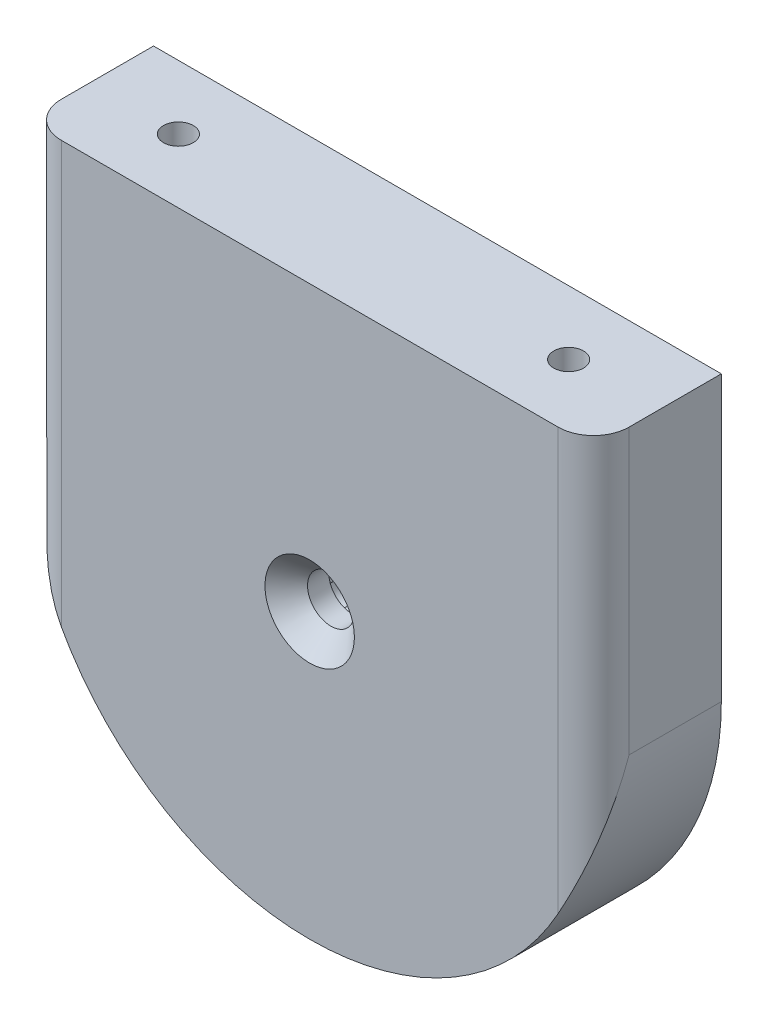
ISO-10303-21;
HEADER;
FILE_DESCRIPTION(('STEP AP214'),'2;1');
FILE_NAME('part.step','',(''),(''),'','','');
FILE_SCHEMA(('AUTOMOTIVE_DESIGN { 1 0 10303 214 1 1 1 1 }'));
ENDSEC;
DATA;
#1=APPLICATION_CONTEXT('core data for automotive mechanical design processes');
#2=APPLICATION_PROTOCOL_DEFINITION('international standard','automotive_design',2000,#1);
#3=PRODUCT_CONTEXT('',#1,'mechanical');
#4=PRODUCT('Part','Part','',(#3));
#5=PRODUCT_RELATED_PRODUCT_CATEGORY('part','',(#4));
#6=PRODUCT_DEFINITION_FORMATION('','',#4);
#7=PRODUCT_DEFINITION_CONTEXT('part definition',#1,'design');
#8=PRODUCT_DEFINITION('design','',#6,#7);
#9=PRODUCT_DEFINITION_SHAPE('','',#8);
#10=(LENGTH_UNIT() NAMED_UNIT(*) SI_UNIT(.MILLI.,.METRE.));
#11=(NAMED_UNIT(*) PLANE_ANGLE_UNIT() SI_UNIT($,.RADIAN.));
#12=(NAMED_UNIT(*) SI_UNIT($,.STERADIAN.) SOLID_ANGLE_UNIT());
#13=UNCERTAINTY_MEASURE_WITH_UNIT(LENGTH_MEASURE(1.E-05),#10,'distance_accuracy_value','');
#14=(GEOMETRIC_REPRESENTATION_CONTEXT(3) GLOBAL_UNCERTAINTY_ASSIGNED_CONTEXT((#13)) GLOBAL_UNIT_ASSIGNED_CONTEXT((#10,
#11,#12)) REPRESENTATION_CONTEXT('',''));
#15=CARTESIAN_POINT('',(0.,0.,0.));
#16=DIRECTION('',(0.,0.,1.));
#17=DIRECTION('',(1.,0.,0.));
#18=AXIS2_PLACEMENT_3D('',#15,#16,#17);
#19=CARTESIAN_POINT('',(0.,0.,0.));
#20=DIRECTION('',(0.,0.,1.));
#21=DIRECTION('',(1.,0.,0.));
#22=AXIS2_PLACEMENT_3D('',#19,#20,#21);
#23=PLANE('',#22);
#24=CARTESIAN_POINT('',(-8.,-8.,0.));
#25=DIRECTION('',(0.,0.,1.));
#26=DIRECTION('',(1.,0.,0.));
#27=AXIS2_PLACEMENT_3D('',#24,#25,#26);
#28=CIRCLE('',#27,2.);
#29=CARTESIAN_POINT('',(-8.,-6.,0.));
#30=VERTEX_POINT('',#29);
#31=CARTESIAN_POINT('',(-6.,-8.,0.));
#32=VERTEX_POINT('',#31);
#33=EDGE_CURVE('E350',#30,#32,#28,.T.);
#34=ORIENTED_EDGE('',*,*,#33,.T.);
#35=DIRECTION('',(1.,0.,0.));
#36=VECTOR('',#35,1.);
#37=CARTESIAN_POINT('',(0.,-8.,0.));
#38=LINE('',#37,#36);
#39=CARTESIAN_POINT('',(6.,-8.,0.));
#40=VERTEX_POINT('',#39);
#41=EDGE_CURVE('E196',#32,#40,#38,.T.);
#42=ORIENTED_EDGE('',*,*,#41,.T.);
#43=CARTESIAN_POINT('',(8.,-8.,0.));
#44=DIRECTION('',(0.,0.,1.));
#45=DIRECTION('',(1.,0.,0.));
#46=AXIS2_PLACEMENT_3D('',#43,#44,#45);
#47=CIRCLE('',#46,2.);
#48=CARTESIAN_POINT('',(8.,-6.,0.));
#49=VERTEX_POINT('',#48);
#50=EDGE_CURVE('E388',#40,#49,#47,.T.);
#51=ORIENTED_EDGE('',*,*,#50,.T.);
#52=DIRECTION('',(0.,1.,0.));
#53=VECTOR('',#52,1.);
#54=CARTESIAN_POINT('',(8.,0.,0.));
#55=LINE('',#54,#53);
#56=CARTESIAN_POINT('',(8.,6.,0.));
#57=VERTEX_POINT('',#56);
#58=EDGE_CURVE('E385',#49,#57,#55,.T.);
#59=ORIENTED_EDGE('',*,*,#58,.T.);
#60=CARTESIAN_POINT('',(8.,8.,0.));
#61=DIRECTION('',(0.,0.,1.));
#62=DIRECTION('',(1.,0.,0.));
#63=AXIS2_PLACEMENT_3D('',#60,#61,#62);
#64=CIRCLE('',#63,2.);
#65=CARTESIAN_POINT('',(6.,8.,0.));
#66=VERTEX_POINT('',#65);
#67=EDGE_CURVE('E382',#57,#66,#64,.T.);
#68=ORIENTED_EDGE('',*,*,#67,.T.);
#69=DIRECTION('',(1.,0.,0.));
#70=VECTOR('',#69,1.);
#71=CARTESIAN_POINT('',(0.,8.,0.));
#72=LINE('',#71,#70);
#73=CARTESIAN_POINT('',(-6.,8.,0.));
#74=VERTEX_POINT('',#73);
#75=EDGE_CURVE('E379',#74,#66,#72,.T.);
#76=ORIENTED_EDGE('',*,*,#75,.F.);
#77=CARTESIAN_POINT('',(-8.,8.,0.));
#78=DIRECTION('',(0.,0.,1.));
#79=DIRECTION('',(1.,0.,0.));
#80=AXIS2_PLACEMENT_3D('',#77,#78,#79);
#81=CIRCLE('',#80,2.);
#82=CARTESIAN_POINT('',(-8.,6.,0.));
#83=VERTEX_POINT('',#82);
#84=EDGE_CURVE('E376',#74,#83,#81,.T.);
#85=ORIENTED_EDGE('',*,*,#84,.T.);
#86=DIRECTION('',(0.,1.,0.));
#87=VECTOR('',#86,1.);
#88=CARTESIAN_POINT('',(-8.,0.,0.));
#89=LINE('',#88,#87);
#90=EDGE_CURVE('E373',#30,#83,#89,.T.);
#91=ORIENTED_EDGE('',*,*,#90,.F.);
#92=EDGE_LOOP('',(#34,#42,#51,#59,#68,#76,#85,#91));
#93=FACE_BOUND('',#92,.T.);
#94=DIRECTION('',(0.,1.,0.));
#95=VECTOR('',#94,1.);
#96=CARTESIAN_POINT('',(40.,0.,0.));
#97=LINE('',#96,#95);
#98=CARTESIAN_POINT('',(40.,0.,0.));
#99=VERTEX_POINT('',#98);
#100=CARTESIAN_POINT('',(40.,40.,0.));
#101=VERTEX_POINT('',#100);
#102=EDGE_CURVE('E185',#99,#101,#97,.T.);
#103=ORIENTED_EDGE('',*,*,#102,.F.);
#104=CARTESIAN_POINT('',(0.,0.,0.));
#105=DIRECTION('',(0.,0.,1.));
#106=DIRECTION('',(1.,0.,0.));
#107=AXIS2_PLACEMENT_3D('',#104,#105,#106);
#108=CIRCLE('',#107,40.);
#109=CARTESIAN_POINT('',(-40.,0.,0.));
#110=VERTEX_POINT('',#109);
#111=EDGE_CURVE('E172',#110,#99,#108,.T.);
#112=ORIENTED_EDGE('',*,*,#111,.F.);
#113=DIRECTION('',(0.,1.,0.));
#114=VECTOR('',#113,1.);
#115=CARTESIAN_POINT('',(-40.,0.,0.));
#116=LINE('',#115,#114);
#117=CARTESIAN_POINT('',(-40.,40.,0.));
#118=VERTEX_POINT('',#117);
#119=EDGE_CURVE('E192',#110,#118,#116,.T.);
#120=ORIENTED_EDGE('',*,*,#119,.T.);
#121=DIRECTION('',(-1.,0.,0.));
#122=VECTOR('',#121,1.);
#123=CARTESIAN_POINT('',(0.,40.,0.));
#124=LINE('',#123,#122);
#125=EDGE_CURVE('E191',#101,#118,#124,.T.);
#126=ORIENTED_EDGE('',*,*,#125,.F.);
#127=EDGE_LOOP('',(#103,#112,#120,#126));
#128=FACE_BOUND('',#127,.T.);
#129=ADVANCED_FACE('F60',(#93,#128),#23,.F.);
#130=CARTESIAN_POINT('',(0.,0.,18.));
#131=DIRECTION('',(0.,0.,1.));
#132=DIRECTION('',(1.,0.,0.));
#133=AXIS2_PLACEMENT_3D('',#130,#131,#132);
#134=PLANE('',#133);
#135=CARTESIAN_POINT('',(0.,0.,18.));
#136=DIRECTION('',(0.,0.,1.));
#137=DIRECTION('',(1.,0.,0.));
#138=AXIS2_PLACEMENT_3D('',#135,#136,#137);
#139=CIRCLE('',#138,6.3);
#140=CARTESIAN_POINT('',(6.3,0.,18.));
#141=VERTEX_POINT('',#140);
#142=EDGE_CURVE('E343',#141,#141,#139,.T.);
#143=ORIENTED_EDGE('',*,*,#142,.F.);
#144=EDGE_LOOP('',(#143));
#145=FACE_BOUND('',#144,.T.);
#146=CARTESIAN_POINT('',(0.,0.,18.));
#147=DIRECTION('',(0.,0.,1.));
#148=DIRECTION('',(1.,0.,0.));
#149=AXIS2_PLACEMENT_3D('',#146,#147,#148);
#150=CIRCLE('',#149,40.);
#151=CARTESIAN_POINT('',(-35.,-19.3649167310371,18.));
#152=VERTEX_POINT('',#151);
#153=CARTESIAN_POINT('',(35.,-19.3649167310371,18.));
#154=VERTEX_POINT('',#153);
#155=EDGE_CURVE('E80',#152,#154,#150,.T.);
#156=ORIENTED_EDGE('',*,*,#155,.T.);
#157=DIRECTION('',(0.,1.,0.));
#158=VECTOR('',#157,1.);
#159=CARTESIAN_POINT('',(35.,40.,18.));
#160=LINE('',#159,#158);
#161=CARTESIAN_POINT('',(35.,40.,18.));
#162=VERTEX_POINT('',#161);
#163=EDGE_CURVE('E206',#154,#162,#160,.T.);
#164=ORIENTED_EDGE('',*,*,#163,.T.);
#165=DIRECTION('',(-1.,0.,0.));
#166=VECTOR('',#165,1.);
#167=CARTESIAN_POINT('',(40.,40.,18.));
#168=LINE('',#167,#166);
#169=CARTESIAN_POINT('',(-35.,40.,18.));
#170=VERTEX_POINT('',#169);
#171=EDGE_CURVE('E226',#162,#170,#168,.T.);
#172=ORIENTED_EDGE('',*,*,#171,.T.);
#173=DIRECTION('',(0.,-1.,0.));
#174=VECTOR('',#173,1.);
#175=CARTESIAN_POINT('',(-35.,0.,18.));
#176=LINE('',#175,#174);
#177=EDGE_CURVE('E229',#170,#152,#176,.T.);
#178=ORIENTED_EDGE('',*,*,#177,.T.);
#179=EDGE_LOOP('',(#156,#164,#172,#178));
#180=FACE_BOUND('',#179,.T.);
#181=ADVANCED_FACE('F286',(#145,#180),#134,.T.);
#182=CARTESIAN_POINT('',(40.,0.,12.));
#183=DIRECTION('',(-1.,0.,0.));
#184=DIRECTION('',(0.,0.,1.));
#185=AXIS2_PLACEMENT_3D('',#182,#183,#184);
#186=PLANE('',#185);
#187=DIRECTION('',(0.,0.,1.));
#188=VECTOR('',#187,1.);
#189=CARTESIAN_POINT('',(40.,0.,0.));
#190=LINE('',#189,#188);
#191=CARTESIAN_POINT('',(40.,0.,13.));
#192=VERTEX_POINT('',#191);
#193=EDGE_CURVE('E175',#99,#192,#190,.T.);
#194=ORIENTED_EDGE('',*,*,#193,.F.);
#195=ORIENTED_EDGE('',*,*,#102,.T.);
#196=DIRECTION('',(0.,0.,-1.));
#197=VECTOR('',#196,1.);
#198=CARTESIAN_POINT('',(40.,40.,12.));
#199=LINE('',#198,#197);
#200=CARTESIAN_POINT('',(40.,40.,13.));
#201=VERTEX_POINT('',#200);
#202=EDGE_CURVE('E203',#201,#101,#199,.T.);
#203=ORIENTED_EDGE('',*,*,#202,.F.);
#204=DIRECTION('',(0.,1.,0.));
#205=VECTOR('',#204,1.);
#206=CARTESIAN_POINT('',(40.,-40.,13.));
#207=LINE('',#206,#205);
#208=EDGE_CURVE('E187',#201,#192,#207,.F.);
#209=ORIENTED_EDGE('',*,*,#208,.T.);
#210=EDGE_LOOP('',(#194,#195,#203,#209));
#211=FACE_BOUND('',#210,.T.);
#212=ADVANCED_FACE('F184',(#211),#186,.F.);
#213=CARTESIAN_POINT('',(35.,0.,13.));
#214=DIRECTION('',(0.,-1.,0.));
#215=DIRECTION('',(0.,0.,-1.));
#216=AXIS2_PLACEMENT_3D('',#213,#214,#215);
#217=CYLINDRICAL_SURFACE('',#216,5.);
#218=ORIENTED_EDGE('',*,*,#163,.F.);
#219=CARTESIAN_POINT('',(35.,-19.3649167310371,18.));
#220=CARTESIAN_POINT('',(35.0801100987979,-19.2201272271632,17.9999969455445));
#221=CARTESIAN_POINT('',(35.1593156939773,-19.0748496907296,17.9980750522835));
#222=CARTESIAN_POINT('',(35.3158753108326,-18.7834050608647,17.9906282423441));
#223=CARTESIAN_POINT('',(35.3932294698841,-18.6372380344488,17.9851035938533));
#224=CARTESIAN_POINT('',(35.6223963735167,-18.1976386462345,17.9634838070175));
#225=CARTESIAN_POINT('',(35.7713893722521,-17.9029709062367,17.9423423794151));
#226=CARTESIAN_POINT('',(36.0613034387328,-17.3115750080069,17.8882851265292));
#227=CARTESIAN_POINT('',(36.2022410152384,-17.0148525715609,17.8553944630915));
#228=CARTESIAN_POINT('',(36.4762940379429,-16.4191203083065,17.7792020500373));
#229=CARTESIAN_POINT('',(36.6094085226241,-16.1201102054096,17.7358990239781));
#230=CARTESIAN_POINT('',(36.9957138065145,-15.2229990401391,17.5926489157128));
#231=CARTESIAN_POINT('',(37.2372460634327,-14.6219977632331,17.4790794251076));
#232=CARTESIAN_POINT('',(37.6892277767598,-13.4141132080577,17.2232108188245));
#233=CARTESIAN_POINT('',(37.8996541343759,-12.8072259117333,17.0808905369767));
#234=CARTESIAN_POINT('',(38.2547848671582,-11.6981709255951,16.8010419768841));
#235=CARTESIAN_POINT('',(38.4045144693854,-11.1966652717049,16.6672002401727));
#236=CARTESIAN_POINT('',(38.683425292738,-10.191404843148,16.3869552681158));
#237=CARTESIAN_POINT('',(38.8126041184351,-9.68764981331612,16.2405505714708));
#238=CARTESIAN_POINT('',(39.0506897018371,-8.67828265637456,15.9375243955675));
#239=CARTESIAN_POINT('',(39.1595909280924,-8.17267006079036,15.7809001442442));
#240=CARTESIAN_POINT('',(39.3573283122318,-7.16008549743071,15.4595279542038));
#241=CARTESIAN_POINT('',(39.4461625170853,-6.65311340219593,15.2947792266684));
#242=CARTESIAN_POINT('',(39.6829894076296,-5.13000941181173,14.7909460709496));
#243=CARTESIAN_POINT('',(39.801176814887,-4.11224179298586,14.4424443494445));
#244=CARTESIAN_POINT('',(39.9591677967913,-2.07544178516794,13.7337158412121));
#245=CARTESIAN_POINT('',(39.9990220591857,-1.05641064128411,13.3734967900493));
#246=CARTESIAN_POINT('',(39.9999940707241,-0.0251415251149277,13.008888870509));
#247=CARTESIAN_POINT('',(39.9999999965136,-0.0125707359977196,13.0044444253613));
#248=CARTESIAN_POINT('',(40.,0.,13.));
#249=B_SPLINE_CURVE_WITH_KNOTS('',3,(#219,#220,#221,#222,#223,#224,#225,#226,#227,#228,#229,
#230,#231,#232,#233,#234,#235,#236,#237,#238,#239,#240,#241,#242,#243,#244,#245,#246,#247,#248),
.UNSPECIFIED.,.F.,.F.,(4,2,2,2,2,2,2,2,2,2,2,2,2,2,4),(0.,0.496388962053697,0.992740977345409,
1.98497557879017,2.97509785271497,3.96534156682049,5.9363996767008,7.9089141914644,
9.5290233946731,11.1493213020121,12.7700605588363,14.3909574868358,17.6345218489833,
20.8759866762589,20.9159866802098),.UNSPECIFIED.);
#250=EDGE_CURVE('E12',#154,#192,#249,.T.);
#251=ORIENTED_EDGE('',*,*,#250,.T.);
#252=ORIENTED_EDGE('',*,*,#208,.F.);
#253=CARTESIAN_POINT('',(35.,40.,13.));
#254=DIRECTION('',(0.,-1.,0.));
#255=DIRECTION('',(1.,0.,0.));
#256=AXIS2_PLACEMENT_3D('',#253,#254,#255);
#257=CIRCLE('',#256,5.);
#258=EDGE_CURVE('E88',#162,#201,#257,.F.);
#259=ORIENTED_EDGE('',*,*,#258,.F.);
#260=EDGE_LOOP('',(#218,#251,#252,#259));
#261=FACE_BOUND('',#260,.T.);
#262=ADVANCED_FACE('F62',(#261),#217,.T.);
#263=CARTESIAN_POINT('',(-40.,0.,12.));
#264=DIRECTION('',(-1.,0.,0.));
#265=DIRECTION('',(0.,0.,1.));
#266=AXIS2_PLACEMENT_3D('',#263,#264,#265);
#267=PLANE('',#266);
#268=ORIENTED_EDGE('',*,*,#119,.F.);
#269=DIRECTION('',(0.,0.,1.));
#270=VECTOR('',#269,1.);
#271=CARTESIAN_POINT('',(-40.,0.,0.));
#272=LINE('',#271,#270);
#273=CARTESIAN_POINT('',(-40.,0.,13.));
#274=VERTEX_POINT('',#273);
#275=EDGE_CURVE('E177',#110,#274,#272,.T.);
#276=ORIENTED_EDGE('',*,*,#275,.T.);
#277=DIRECTION('',(0.,-1.,0.));
#278=VECTOR('',#277,1.);
#279=CARTESIAN_POINT('',(-40.,0.,13.));
#280=LINE('',#279,#278);
#281=CARTESIAN_POINT('',(-40.,40.,13.));
#282=VERTEX_POINT('',#281);
#283=EDGE_CURVE('E232',#274,#282,#280,.F.);
#284=ORIENTED_EDGE('',*,*,#283,.T.);
#285=DIRECTION('',(0.,0.,-1.));
#286=VECTOR('',#285,1.);
#287=CARTESIAN_POINT('',(-40.,40.,12.));
#288=LINE('',#287,#286);
#289=EDGE_CURVE('E200',#282,#118,#288,.T.);
#290=ORIENTED_EDGE('',*,*,#289,.T.);
#291=EDGE_LOOP('',(#268,#276,#284,#290));
#292=FACE_BOUND('',#291,.T.);
#293=ADVANCED_FACE('F247',(#292),#267,.T.);
#294=CARTESIAN_POINT('',(-35.,0.,13.));
#295=DIRECTION('',(0.,-1.,0.));
#296=DIRECTION('',(0.,0.,-1.));
#297=AXIS2_PLACEMENT_3D('',#294,#295,#296);
#298=CYLINDRICAL_SURFACE('',#297,5.);
#299=ORIENTED_EDGE('',*,*,#283,.F.);
#300=CARTESIAN_POINT('',(-35.,-19.3649167310371,18.));
#301=CARTESIAN_POINT('',(-35.0801100987981,-19.2201272271627,17.9999969455445));
#302=CARTESIAN_POINT('',(-35.1593156939779,-19.0748496907286,17.9980750522835));
#303=CARTESIAN_POINT('',(-35.3158753108336,-18.7834050608627,17.990628242344));
#304=CARTESIAN_POINT('',(-35.3932294698855,-18.6372380344463,17.9851035938532));
#305=CARTESIAN_POINT('',(-35.6223963735187,-18.1976386462304,17.9634838070173));
#306=CARTESIAN_POINT('',(-35.7713893722546,-17.9029709062316,17.9423423794148));
#307=CARTESIAN_POINT('',(-36.0613034387361,-17.311575008,17.8882851265285));
#308=CARTESIAN_POINT('',(-36.202241015242,-17.0148525715531,17.8553944630906));
#309=CARTESIAN_POINT('',(-36.4762940379471,-16.4191203082971,17.779202050036));
#310=CARTESIAN_POINT('',(-36.6094085226285,-16.1201102053994,17.7358990239766));
#311=CARTESIAN_POINT('',(-36.9957138065182,-15.22299904013,17.5926489157111));
#312=CARTESIAN_POINT('',(-37.2372460634355,-14.621997763226,17.4790794251062));
#313=CARTESIAN_POINT('',(-37.689227776761,-13.4141132080543,17.2232108188237));
#314=CARTESIAN_POINT('',(-37.8996541343764,-12.8072259117316,17.0808905369762));
#315=CARTESIAN_POINT('',(-38.2547848671581,-11.6981709255953,16.8010419768842));
#316=CARTESIAN_POINT('',(-38.4045144693853,-11.1966652717053,16.6672002401728));
#317=CARTESIAN_POINT('',(-38.6834252927378,-10.1914048431488,16.386955268116));
#318=CARTESIAN_POINT('',(-38.8126041184348,-9.68764981331712,16.2405505714709));
#319=CARTESIAN_POINT('',(-39.0506897018368,-8.67828265637618,15.9375243955681));
#320=CARTESIAN_POINT('',(-39.1595909280919,-8.17267006079235,15.7809001442453));
#321=CARTESIAN_POINT('',(-39.3573283122312,-7.160085497434,15.4595279542043));
#322=CARTESIAN_POINT('',(-39.4461625170847,-6.65311340220017,15.2947792266677));
#323=CARTESIAN_POINT('',(-39.6829894076291,-5.1300094118139,14.7909460709545));
#324=CARTESIAN_POINT('',(-39.8011768148867,-4.11224179298156,14.4424443494662));
#325=CARTESIAN_POINT('',(-39.9591677967912,-2.07544178517699,13.733715841192));
#326=CARTESIAN_POINT('',(-39.9990220591859,-1.05641064131298,13.3734967899708));
#327=CARTESIAN_POINT('',(-39.9999940707241,-0.0251415251157563,13.0088888705071));
#328=CARTESIAN_POINT('',(-39.9999999965136,-0.0125707359981375,13.0044444253604));
#329=CARTESIAN_POINT('',(-40.,0.,13.));
#330=B_SPLINE_CURVE_WITH_KNOTS('',3,(#300,#301,#302,#303,#304,#305,#306,#307,#308,#309,#310,
#311,#312,#313,#314,#315,#316,#317,#318,#319,#320,#321,#322,#323,#324,#325,#326,#327,#328,#329),
.UNSPECIFIED.,.F.,.F.,(4,2,2,2,2,2,2,2,2,2,2,2,2,2,4),(0.,0.496388962055408,0.992740977348829,
1.98497557879701,2.97509785272447,3.96534156683264,5.93639967670646,7.90891419146437,
9.52902339467252,11.1493213020109,12.7700605588335,14.3909574868316,17.6345218489807,
20.8759866762587,20.9159866802098),.UNSPECIFIED.);
#331=EDGE_CURVE('E73',#274,#152,#330,.F.);
#332=ORIENTED_EDGE('',*,*,#331,.T.);
#333=ORIENTED_EDGE('',*,*,#177,.F.);
#334=CARTESIAN_POINT('',(-35.,40.,13.));
#335=DIRECTION('',(0.,-1.,0.));
#336=DIRECTION('',(1.,0.,0.));
#337=AXIS2_PLACEMENT_3D('',#334,#335,#336);
#338=CIRCLE('',#337,5.);
#339=EDGE_CURVE('E235',#282,#170,#338,.F.);
#340=ORIENTED_EDGE('',*,*,#339,.F.);
#341=EDGE_LOOP('',(#299,#332,#333,#340));
#342=FACE_BOUND('',#341,.T.);
#343=ADVANCED_FACE('F242',(#342),#298,.T.);
#344=CARTESIAN_POINT('',(-8.,-8.,12.));
#345=DIRECTION('',(0.,0.,-1.));
#346=DIRECTION('',(-1.,0.,0.));
#347=AXIS2_PLACEMENT_3D('',#344,#345,#346);
#348=CYLINDRICAL_SURFACE('',#347,2.);
#349=ORIENTED_EDGE('',*,*,#33,.F.);
#350=DIRECTION('',(0.,0.,-1.));
#351=VECTOR('',#350,1.);
#352=CARTESIAN_POINT('',(-8.,-6.,12.));
#353=LINE('',#352,#351);
#354=CARTESIAN_POINT('',(-8.,-6.,12.));
#355=VERTEX_POINT('',#354);
#356=EDGE_CURVE('E204',#355,#30,#353,.T.);
#357=ORIENTED_EDGE('',*,*,#356,.F.);
#358=CARTESIAN_POINT('',(-8.,-8.,12.));
#359=DIRECTION('',(0.,0.,1.));
#360=DIRECTION('',(1.,0.,0.));
#361=AXIS2_PLACEMENT_3D('',#358,#359,#360);
#362=CIRCLE('',#361,2.);
#363=CARTESIAN_POINT('',(-6.,-8.,12.));
#364=VERTEX_POINT('',#363);
#365=EDGE_CURVE('E194',#355,#364,#362,.T.);
#366=ORIENTED_EDGE('',*,*,#365,.T.);
#367=DIRECTION('',(0.,0.,-1.));
#368=VECTOR('',#367,1.);
#369=CARTESIAN_POINT('',(-6.,-8.,12.));
#370=LINE('',#369,#368);
#371=EDGE_CURVE('E207',#364,#32,#370,.T.);
#372=ORIENTED_EDGE('',*,*,#371,.T.);
#373=EDGE_LOOP('',(#349,#357,#366,#372));
#374=FACE_BOUND('',#373,.T.);
#375=ADVANCED_FACE('F246',(#374),#348,.F.);
#376=CARTESIAN_POINT('',(-8.,0.,12.));
#377=DIRECTION('',(-1.,0.,0.));
#378=DIRECTION('',(0.,0.,1.));
#379=AXIS2_PLACEMENT_3D('',#376,#377,#378);
#380=PLANE('',#379);
#381=ORIENTED_EDGE('',*,*,#90,.T.);
#382=DIRECTION('',(0.,0.,-1.));
#383=VECTOR('',#382,1.);
#384=CARTESIAN_POINT('',(-8.,6.,12.));
#385=LINE('',#384,#383);
#386=CARTESIAN_POINT('',(-8.,6.,12.));
#387=VERTEX_POINT('',#386);
#388=EDGE_CURVE('E220',#387,#83,#385,.T.);
#389=ORIENTED_EDGE('',*,*,#388,.F.);
#390=DIRECTION('',(0.,1.,0.));
#391=VECTOR('',#390,1.);
#392=CARTESIAN_POINT('',(-8.,0.,12.));
#393=LINE('',#392,#391);
#394=EDGE_CURVE('E353',#355,#387,#393,.T.);
#395=ORIENTED_EDGE('',*,*,#394,.F.);
#396=ORIENTED_EDGE('',*,*,#356,.T.);
#397=EDGE_LOOP('',(#381,#389,#395,#396));
#398=FACE_BOUND('',#397,.T.);
#399=ADVANCED_FACE('F251',(#398),#380,.F.);
#400=CARTESIAN_POINT('',(-8.,8.,12.));
#401=DIRECTION('',(0.,0.,-1.));
#402=DIRECTION('',(-1.,0.,0.));
#403=AXIS2_PLACEMENT_3D('',#400,#401,#402);
#404=CYLINDRICAL_SURFACE('',#403,2.);
#405=ORIENTED_EDGE('',*,*,#84,.F.);
#406=DIRECTION('',(0.,0.,-1.));
#407=VECTOR('',#406,1.);
#408=CARTESIAN_POINT('',(-6.,8.,12.));
#409=LINE('',#408,#407);
#410=CARTESIAN_POINT('',(-6.,8.,12.));
#411=VERTEX_POINT('',#410);
#412=EDGE_CURVE('E218',#411,#74,#409,.T.);
#413=ORIENTED_EDGE('',*,*,#412,.F.);
#414=CARTESIAN_POINT('',(-8.,8.,12.));
#415=DIRECTION('',(0.,0.,1.));
#416=DIRECTION('',(1.,0.,0.));
#417=AXIS2_PLACEMENT_3D('',#414,#415,#416);
#418=CIRCLE('',#417,2.);
#419=EDGE_CURVE('E355',#411,#387,#418,.T.);
#420=ORIENTED_EDGE('',*,*,#419,.T.);
#421=ORIENTED_EDGE('',*,*,#388,.T.);
#422=EDGE_LOOP('',(#405,#413,#420,#421));
#423=FACE_BOUND('',#422,.T.);
#424=ADVANCED_FACE('F255',(#423),#404,.F.);
#425=CARTESIAN_POINT('',(0.,8.,12.));
#426=DIRECTION('',(0.,1.,0.));
#427=DIRECTION('',(0.,0.,1.));
#428=AXIS2_PLACEMENT_3D('',#425,#426,#427);
#429=PLANE('',#428);
#430=ORIENTED_EDGE('',*,*,#75,.T.);
#431=DIRECTION('',(0.,0.,-1.));
#432=VECTOR('',#431,1.);
#433=CARTESIAN_POINT('',(6.,8.,12.));
#434=LINE('',#433,#432);
#435=CARTESIAN_POINT('',(6.,8.,12.));
#436=VERTEX_POINT('',#435);
#437=EDGE_CURVE('E216',#436,#66,#434,.T.);
#438=ORIENTED_EDGE('',*,*,#437,.F.);
#439=DIRECTION('',(1.,0.,0.));
#440=VECTOR('',#439,1.);
#441=CARTESIAN_POINT('',(0.,8.,12.));
#442=LINE('',#441,#440);
#443=EDGE_CURVE('E358',#411,#436,#442,.T.);
#444=ORIENTED_EDGE('',*,*,#443,.F.);
#445=ORIENTED_EDGE('',*,*,#412,.T.);
#446=EDGE_LOOP('',(#430,#438,#444,#445));
#447=FACE_BOUND('',#446,.T.);
#448=ADVANCED_FACE('F259',(#447),#429,.F.);
#449=CARTESIAN_POINT('',(8.,8.,12.));
#450=DIRECTION('',(0.,0.,-1.));
#451=DIRECTION('',(-1.,0.,0.));
#452=AXIS2_PLACEMENT_3D('',#449,#450,#451);
#453=CYLINDRICAL_SURFACE('',#452,2.);
#454=ORIENTED_EDGE('',*,*,#67,.F.);
#455=DIRECTION('',(0.,0.,-1.));
#456=VECTOR('',#455,1.);
#457=CARTESIAN_POINT('',(8.,6.,12.));
#458=LINE('',#457,#456);
#459=CARTESIAN_POINT('',(8.,6.,12.));
#460=VERTEX_POINT('',#459);
#461=EDGE_CURVE('E214',#460,#57,#458,.T.);
#462=ORIENTED_EDGE('',*,*,#461,.F.);
#463=CARTESIAN_POINT('',(8.,8.,12.));
#464=DIRECTION('',(0.,0.,1.));
#465=DIRECTION('',(1.,0.,0.));
#466=AXIS2_PLACEMENT_3D('',#463,#464,#465);
#467=CIRCLE('',#466,2.);
#468=EDGE_CURVE('E360',#460,#436,#467,.T.);
#469=ORIENTED_EDGE('',*,*,#468,.T.);
#470=ORIENTED_EDGE('',*,*,#437,.T.);
#471=EDGE_LOOP('',(#454,#462,#469,#470));
#472=FACE_BOUND('',#471,.T.);
#473=ADVANCED_FACE('F263',(#472),#453,.F.);
#474=CARTESIAN_POINT('',(8.,0.,12.));
#475=DIRECTION('',(-1.,0.,0.));
#476=DIRECTION('',(0.,0.,1.));
#477=AXIS2_PLACEMENT_3D('',#474,#475,#476);
#478=PLANE('',#477);
#479=ORIENTED_EDGE('',*,*,#58,.F.);
#480=DIRECTION('',(0.,0.,-1.));
#481=VECTOR('',#480,1.);
#482=CARTESIAN_POINT('',(8.,-6.,12.));
#483=LINE('',#482,#481);
#484=CARTESIAN_POINT('',(8.,-6.,12.));
#485=VERTEX_POINT('',#484);
#486=EDGE_CURVE('E212',#485,#49,#483,.T.);
#487=ORIENTED_EDGE('',*,*,#486,.F.);
#488=DIRECTION('',(0.,1.,0.));
#489=VECTOR('',#488,1.);
#490=CARTESIAN_POINT('',(8.,0.,12.));
#491=LINE('',#490,#489);
#492=EDGE_CURVE('E363',#485,#460,#491,.T.);
#493=ORIENTED_EDGE('',*,*,#492,.T.);
#494=ORIENTED_EDGE('',*,*,#461,.T.);
#495=EDGE_LOOP('',(#479,#487,#493,#494));
#496=FACE_BOUND('',#495,.T.);
#497=ADVANCED_FACE('F267',(#496),#478,.T.);
#498=CARTESIAN_POINT('',(8.,-8.,12.));
#499=DIRECTION('',(0.,0.,-1.));
#500=DIRECTION('',(-1.,0.,0.));
#501=AXIS2_PLACEMENT_3D('',#498,#499,#500);
#502=CYLINDRICAL_SURFACE('',#501,2.);
#503=ORIENTED_EDGE('',*,*,#50,.F.);
#504=DIRECTION('',(0.,0.,-1.));
#505=VECTOR('',#504,1.);
#506=CARTESIAN_POINT('',(6.,-8.,12.));
#507=LINE('',#506,#505);
#508=CARTESIAN_POINT('',(6.,-8.,12.));
#509=VERTEX_POINT('',#508);
#510=EDGE_CURVE('E209',#509,#40,#507,.T.);
#511=ORIENTED_EDGE('',*,*,#510,.F.);
#512=CARTESIAN_POINT('',(8.,-8.,12.));
#513=DIRECTION('',(0.,0.,1.));
#514=DIRECTION('',(1.,0.,0.));
#515=AXIS2_PLACEMENT_3D('',#512,#513,#514);
#516=CIRCLE('',#515,2.);
#517=EDGE_CURVE('E366',#509,#485,#516,.T.);
#518=ORIENTED_EDGE('',*,*,#517,.T.);
#519=ORIENTED_EDGE('',*,*,#486,.T.);
#520=EDGE_LOOP('',(#503,#511,#518,#519));
#521=FACE_BOUND('',#520,.T.);
#522=ADVANCED_FACE('F271',(#521),#502,.F.);
#523=CARTESIAN_POINT('',(0.,-8.,12.));
#524=DIRECTION('',(0.,1.,0.));
#525=DIRECTION('',(0.,0.,1.));
#526=AXIS2_PLACEMENT_3D('',#523,#524,#525);
#527=PLANE('',#526);
#528=ORIENTED_EDGE('',*,*,#41,.F.);
#529=ORIENTED_EDGE('',*,*,#371,.F.);
#530=DIRECTION('',(1.,0.,0.));
#531=VECTOR('',#530,1.);
#532=CARTESIAN_POINT('',(0.,-8.,12.));
#533=LINE('',#532,#531);
#534=EDGE_CURVE('E210',#364,#509,#533,.T.);
#535=ORIENTED_EDGE('',*,*,#534,.T.);
#536=ORIENTED_EDGE('',*,*,#510,.T.);
#537=EDGE_LOOP('',(#528,#529,#535,#536));
#538=FACE_BOUND('',#537,.T.);
#539=ADVANCED_FACE('F275',(#538),#527,.T.);
#540=CARTESIAN_POINT('',(0.,40.,12.));
#541=DIRECTION('',(0.,-1.,0.));
#542=DIRECTION('',(1.,0.,0.));
#543=AXIS2_PLACEMENT_3D('',#540,#541,#542);
#544=PLANE('',#543);
#545=CARTESIAN_POINT('',(-27.4999999999999,40.,9.));
#546=DIRECTION('',(0.,1.,0.));
#547=DIRECTION('',(0.,0.,1.));
#548=AXIS2_PLACEMENT_3D('',#545,#546,#547);
#549=CIRCLE('',#548,2.1);
#550=CARTESIAN_POINT('',(-27.4999999999999,40.,11.1));
#551=VERTEX_POINT('',#550);
#552=EDGE_CURVE('E331',#551,#551,#549,.T.);
#553=ORIENTED_EDGE('',*,*,#552,.F.);
#554=EDGE_LOOP('',(#553));
#555=FACE_BOUND('',#554,.T.);
#556=CARTESIAN_POINT('',(27.5000000000001,40.,9.01263424518537));
#557=DIRECTION('',(0.,1.,0.));
#558=DIRECTION('',(0.,0.,1.));
#559=AXIS2_PLACEMENT_3D('',#556,#557,#558);
#560=CIRCLE('',#559,2.1);
#561=CARTESIAN_POINT('',(27.5000000000001,40.,11.1126342451854));
#562=VERTEX_POINT('',#561);
#563=EDGE_CURVE('E333',#562,#562,#560,.T.);
#564=ORIENTED_EDGE('',*,*,#563,.F.);
#565=EDGE_LOOP('',(#564));
#566=FACE_BOUND('',#565,.T.);
#567=ORIENTED_EDGE('',*,*,#289,.F.);
#568=ORIENTED_EDGE('',*,*,#339,.T.);
#569=ORIENTED_EDGE('',*,*,#171,.F.);
#570=ORIENTED_EDGE('',*,*,#258,.T.);
#571=ORIENTED_EDGE('',*,*,#202,.T.);
#572=ORIENTED_EDGE('',*,*,#125,.T.);
#573=EDGE_LOOP('',(#567,#568,#569,#570,#571,#572));
#574=FACE_BOUND('',#573,.T.);
#575=ADVANCED_FACE('F279',(#555,#566,#574),#544,.F.);
#576=CARTESIAN_POINT('',(0.,0.,12.));
#577=DIRECTION('',(0.,0.,1.));
#578=DIRECTION('',(1.,0.,0.));
#579=AXIS2_PLACEMENT_3D('',#576,#577,#578);
#580=PLANE('',#579);
#581=CARTESIAN_POINT('',(0.,0.,12.));
#582=DIRECTION('',(0.,0.,1.));
#583=DIRECTION('',(1.,0.,0.));
#584=AXIS2_PLACEMENT_3D('',#581,#582,#583);
#585=CIRCLE('',#584,3.3);
#586=CARTESIAN_POINT('',(3.3,0.,12.));
#587=VERTEX_POINT('',#586);
#588=EDGE_CURVE('E223',#587,#587,#585,.T.);
#589=ORIENTED_EDGE('',*,*,#588,.T.);
#590=EDGE_LOOP('',(#589));
#591=FACE_BOUND('',#590,.T.);
#592=ORIENTED_EDGE('',*,*,#365,.F.);
#593=ORIENTED_EDGE('',*,*,#394,.T.);
#594=ORIENTED_EDGE('',*,*,#419,.F.);
#595=ORIENTED_EDGE('',*,*,#443,.T.);
#596=ORIENTED_EDGE('',*,*,#468,.F.);
#597=ORIENTED_EDGE('',*,*,#492,.F.);
#598=ORIENTED_EDGE('',*,*,#517,.F.);
#599=ORIENTED_EDGE('',*,*,#534,.F.);
#600=EDGE_LOOP('',(#592,#593,#594,#595,#596,#597,#598,#599));
#601=FACE_BOUND('',#600,.T.);
#602=ADVANCED_FACE('F289',(#591,#601),#580,.F.);
#603=CARTESIAN_POINT('',(0.,0.,18.));
#604=DIRECTION('',(0.,0.,1.));
#605=DIRECTION('',(1.,0.,0.));
#606=AXIS2_PLACEMENT_3D('',#603,#604,#605);
#607=CYLINDRICAL_SURFACE('',#606,3.3);
#608=CARTESIAN_POINT('',(0.,0.,15.));
#609=DIRECTION('',(0.,0.,1.));
#610=DIRECTION('',(1.,0.,0.));
#611=AXIS2_PLACEMENT_3D('',#608,#609,#610);
#612=CIRCLE('',#611,3.3);
#613=CARTESIAN_POINT('',(3.3,0.,15.));
#614=VERTEX_POINT('',#613);
#615=EDGE_CURVE('E227',#614,#614,#612,.T.);
#616=ORIENTED_EDGE('',*,*,#615,.T.);
#617=EDGE_LOOP('',(#616));
#618=FACE_BOUND('',#617,.T.);
#619=ORIENTED_EDGE('',*,*,#588,.F.);
#620=EDGE_LOOP('',(#619));
#621=FACE_BOUND('',#620,.T.);
#622=ADVANCED_FACE('F296',(#618,#621),#607,.F.);
#623=CARTESIAN_POINT('',(0.,0.,18.));
#624=DIRECTION('',(0.,0.,1.));
#625=DIRECTION('',(1.,0.,0.));
#626=AXIS2_PLACEMENT_3D('',#623,#624,#625);
#627=CONICAL_SURFACE('',#626,6.3,0.785398163397449);
#628=ORIENTED_EDGE('',*,*,#615,.F.);
#629=EDGE_LOOP('',(#628));
#630=FACE_BOUND('',#629,.T.);
#631=ORIENTED_EDGE('',*,*,#142,.T.);
#632=EDGE_LOOP('',(#631));
#633=FACE_BOUND('',#632,.T.);
#634=ADVANCED_FACE('F303',(#630,#633),#627,.F.);
#635=CARTESIAN_POINT('',(27.5000000000001,27.6,9.01263424518537));
#636=DIRECTION('',(0.,1.,0.));
#637=DIRECTION('',(0.,0.,1.));
#638=AXIS2_PLACEMENT_3D('',#635,#636,#637);
#639=CONICAL_SURFACE('',#638,2.1,1.02974425867665);
#640=CARTESIAN_POINT('',(27.5000000000001,26.3381927000421,9.01263424518537));
#641=VERTEX_POINT('',#640);
#642=VERTEX_LOOP('',#641);
#643=FACE_BOUND('',#642,.T.);
#644=CARTESIAN_POINT('',(27.5000000000001,27.6,9.01263424518537));
#645=DIRECTION('',(0.,1.,0.));
#646=DIRECTION('',(0.,0.,1.));
#647=AXIS2_PLACEMENT_3D('',#644,#645,#646);
#648=CIRCLE('',#647,2.1);
#649=CARTESIAN_POINT('',(27.5000000000001,27.6,11.1126342451854));
#650=VERTEX_POINT('',#649);
#651=EDGE_CURVE('E340',#650,#650,#648,.T.);
#652=ORIENTED_EDGE('',*,*,#651,.T.);
#653=EDGE_LOOP('',(#652));
#654=FACE_BOUND('',#653,.T.);
#655=ADVANCED_FACE('F307',(#643,#654),#639,.F.);
#656=CARTESIAN_POINT('',(27.5000000000001,40.,9.01263424518537));
#657=DIRECTION('',(0.,1.,0.));
#658=DIRECTION('',(0.,0.,1.));
#659=AXIS2_PLACEMENT_3D('',#656,#657,#658);
#660=CYLINDRICAL_SURFACE('',#659,2.1);
#661=ORIENTED_EDGE('',*,*,#651,.F.);
#662=EDGE_LOOP('',(#661));
#663=FACE_BOUND('',#662,.T.);
#664=ORIENTED_EDGE('',*,*,#563,.T.);
#665=EDGE_LOOP('',(#664));
#666=FACE_BOUND('',#665,.T.);
#667=ADVANCED_FACE('F311',(#663,#666),#660,.F.);
#668=CARTESIAN_POINT('',(-27.4999999999999,27.6,9.));
#669=DIRECTION('',(0.,1.,0.));
#670=DIRECTION('',(0.,0.,1.));
#671=AXIS2_PLACEMENT_3D('',#668,#669,#670);
#672=CONICAL_SURFACE('',#671,2.1,1.02974425867665);
#673=CARTESIAN_POINT('',(-27.4999999999999,26.3381927000421,9.));
#674=VERTEX_POINT('',#673);
#675=VERTEX_LOOP('',#674);
#676=FACE_BOUND('',#675,.T.);
#677=CARTESIAN_POINT('',(-27.4999999999999,27.6,9.));
#678=DIRECTION('',(0.,1.,0.));
#679=DIRECTION('',(0.,0.,1.));
#680=AXIS2_PLACEMENT_3D('',#677,#678,#679);
#681=CIRCLE('',#680,2.1);
#682=CARTESIAN_POINT('',(-27.4999999999999,27.6,11.1));
#683=VERTEX_POINT('',#682);
#684=EDGE_CURVE('E328',#683,#683,#681,.T.);
#685=ORIENTED_EDGE('',*,*,#684,.T.);
#686=EDGE_LOOP('',(#685));
#687=FACE_BOUND('',#686,.T.);
#688=ADVANCED_FACE('F315',(#676,#687),#672,.F.);
#689=CARTESIAN_POINT('',(-27.4999999999999,40.,9.));
#690=DIRECTION('',(0.,1.,0.));
#691=DIRECTION('',(0.,0.,1.));
#692=AXIS2_PLACEMENT_3D('',#689,#690,#691);
#693=CYLINDRICAL_SURFACE('',#692,2.1);
#694=ORIENTED_EDGE('',*,*,#684,.F.);
#695=EDGE_LOOP('',(#694));
#696=FACE_BOUND('',#695,.T.);
#697=ORIENTED_EDGE('',*,*,#552,.T.);
#698=EDGE_LOOP('',(#697));
#699=FACE_BOUND('',#698,.T.);
#700=ADVANCED_FACE('F318',(#696,#699),#693,.F.);
#701=CARTESIAN_POINT('',(0.,0.,0.));
#702=DIRECTION('',(0.,0.,1.));
#703=DIRECTION('',(1.,0.,0.));
#704=AXIS2_PLACEMENT_3D('',#701,#702,#703);
#705=CYLINDRICAL_SURFACE('',#704,40.);
#706=ORIENTED_EDGE('',*,*,#275,.F.);
#707=ORIENTED_EDGE('',*,*,#111,.T.);
#708=ORIENTED_EDGE('',*,*,#193,.T.);
#709=ORIENTED_EDGE('',*,*,#250,.F.);
#710=ORIENTED_EDGE('',*,*,#155,.F.);
#711=ORIENTED_EDGE('',*,*,#331,.F.);
#712=EDGE_LOOP('',(#706,#707,#708,#709,#710,#711));
#713=FACE_BOUND('',#712,.T.);
#714=ADVANCED_FACE('F174',(#713),#705,.T.);
#715=CLOSED_SHELL('',(#129,#181,#212,#262,#293,#343,#375,#399,#424,#448,#473,#497,#522,#539,
#575,#602,#622,#634,#655,#667,#688,#700,#714));
#716=MANIFOLD_SOLID_BREP('B2',#715);
#717=ADVANCED_BREP_SHAPE_REPRESENTATION('',(#18,#716),#14);
#718=SHAPE_DEFINITION_REPRESENTATION(#9,#717);
ENDSEC;
END-ISO-10303-21;
